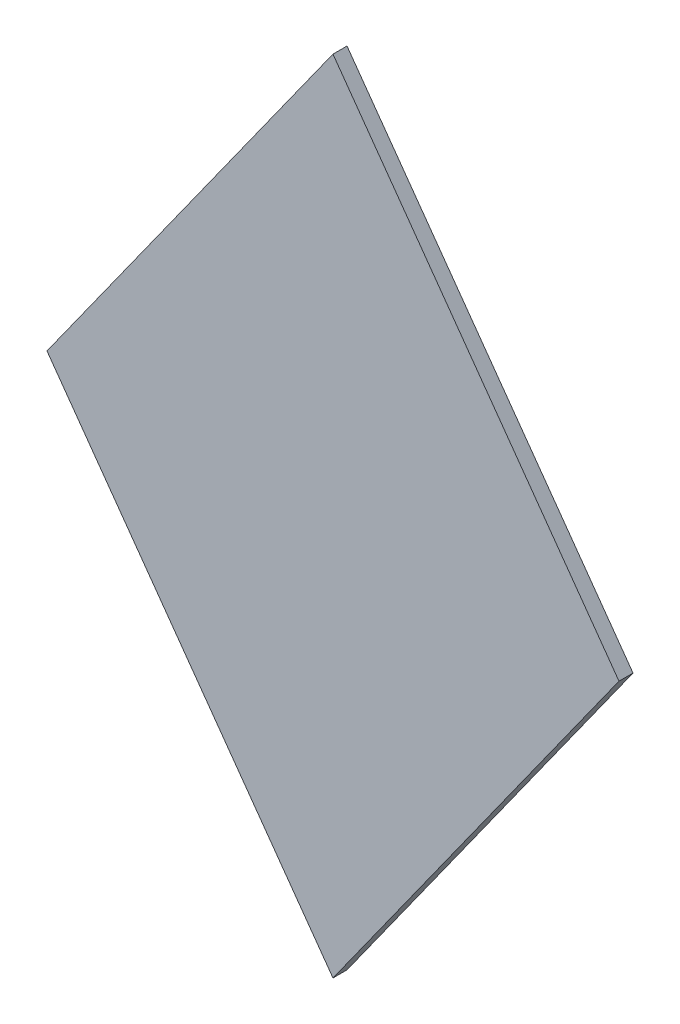
ISO-10303-21;
HEADER;
FILE_DESCRIPTION(('STEP AP214'),'2;1');
FILE_NAME('part.step','',(''),(''),'','','');
FILE_SCHEMA(('AUTOMOTIVE_DESIGN { 1 0 10303 214 1 1 1 1 }'));
ENDSEC;
DATA;
#1=APPLICATION_CONTEXT('core data for automotive mechanical design processes');
#2=APPLICATION_PROTOCOL_DEFINITION('international standard','automotive_design',2000,#1);
#3=PRODUCT_CONTEXT('',#1,'mechanical');
#4=PRODUCT('Part','Part','',(#3));
#5=PRODUCT_RELATED_PRODUCT_CATEGORY('part','',(#4));
#6=PRODUCT_DEFINITION_FORMATION('','',#4);
#7=PRODUCT_DEFINITION_CONTEXT('part definition',#1,'design');
#8=PRODUCT_DEFINITION('design','',#6,#7);
#9=PRODUCT_DEFINITION_SHAPE('','',#8);
#10=(LENGTH_UNIT() NAMED_UNIT(*) SI_UNIT(.MILLI.,.METRE.));
#11=(NAMED_UNIT(*) PLANE_ANGLE_UNIT() SI_UNIT($,.RADIAN.));
#12=(NAMED_UNIT(*) SI_UNIT($,.STERADIAN.) SOLID_ANGLE_UNIT());
#13=UNCERTAINTY_MEASURE_WITH_UNIT(LENGTH_MEASURE(1.E-05),#10,'distance_accuracy_value','');
#14=(GEOMETRIC_REPRESENTATION_CONTEXT(3) GLOBAL_UNCERTAINTY_ASSIGNED_CONTEXT((#13)) GLOBAL_UNIT_ASSIGNED_CONTEXT((#10,
#11,#12)) REPRESENTATION_CONTEXT('',''));
#15=CARTESIAN_POINT('',(0.,0.,0.));
#16=DIRECTION('',(0.,0.,1.));
#17=DIRECTION('',(1.,0.,0.));
#18=AXIS2_PLACEMENT_3D('',#15,#16,#17);
#19=CARTESIAN_POINT('',(40.75,0.,2.));
#20=DIRECTION('',(-0.813492323592446,-0.581575652392845,0.));
#21=DIRECTION('',(0.581575652392845,-0.813492323592446,0.));
#22=AXIS2_PLACEMENT_3D('',#19,#20,#21);
#23=PLANE('',#22);
#24=DIRECTION('',(-0.581575652392845,0.813492323592446,0.));
#25=VECTOR('',#24,1.);
#26=CARTESIAN_POINT('',(40.75,0.,0.));
#27=LINE('',#26,#25);
#28=CARTESIAN_POINT('',(40.75,0.,0.));
#29=VERTEX_POINT('',#28);
#30=CARTESIAN_POINT('',(0.,57.,0.));
#31=VERTEX_POINT('',#30);
#32=EDGE_CURVE('E96',#29,#31,#27,.T.);
#33=ORIENTED_EDGE('',*,*,#32,.T.);
#34=DIRECTION('',(0.,0.,-1.));
#35=VECTOR('',#34,1.);
#36=CARTESIAN_POINT('',(0.,57.,2.));
#37=LINE('',#36,#35);
#38=CARTESIAN_POINT('',(0.,57.,2.));
#39=VERTEX_POINT('',#38);
#40=EDGE_CURVE('E11',#39,#31,#37,.T.);
#41=ORIENTED_EDGE('',*,*,#40,.F.);
#42=DIRECTION('',(-0.581575652392845,0.813492323592446,0.));
#43=VECTOR('',#42,1.);
#44=CARTESIAN_POINT('',(40.75,0.,2.));
#45=LINE('',#44,#43);
#46=CARTESIAN_POINT('',(40.75,0.,2.));
#47=VERTEX_POINT('',#46);
#48=EDGE_CURVE('E84',#47,#39,#45,.T.);
#49=ORIENTED_EDGE('',*,*,#48,.F.);
#50=DIRECTION('',(0.,0.,-1.));
#51=VECTOR('',#50,1.);
#52=CARTESIAN_POINT('',(40.75,0.,2.));
#53=LINE('',#52,#51);
#54=EDGE_CURVE('E92',#47,#29,#53,.T.);
#55=ORIENTED_EDGE('',*,*,#54,.T.);
#56=EDGE_LOOP('',(#33,#41,#49,#55));
#57=FACE_BOUND('',#56,.T.);
#58=ADVANCED_FACE('F33',(#57),#23,.F.);
#59=CARTESIAN_POINT('',(0.,57.,2.));
#60=DIRECTION('',(0.813492323592446,-0.581575652392845,0.));
#61=DIRECTION('',(0.581575652392845,0.813492323592446,0.));
#62=AXIS2_PLACEMENT_3D('',#59,#60,#61);
#63=PLANE('',#62);
#64=DIRECTION('',(-0.581575652392845,-0.813492323592446,0.));
#65=VECTOR('',#64,1.);
#66=CARTESIAN_POINT('',(0.,57.,0.));
#67=LINE('',#66,#65);
#68=CARTESIAN_POINT('',(-40.75,0.,0.));
#69=VERTEX_POINT('',#68);
#70=EDGE_CURVE('E88',#31,#69,#67,.T.);
#71=ORIENTED_EDGE('',*,*,#70,.T.);
#72=DIRECTION('',(0.,0.,-1.));
#73=VECTOR('',#72,1.);
#74=CARTESIAN_POINT('',(-40.75,0.,2.));
#75=LINE('',#74,#73);
#76=CARTESIAN_POINT('',(-40.75,0.,2.));
#77=VERTEX_POINT('',#76);
#78=EDGE_CURVE('E41',#77,#69,#75,.T.);
#79=ORIENTED_EDGE('',*,*,#78,.F.);
#80=DIRECTION('',(-0.581575652392845,-0.813492323592446,0.));
#81=VECTOR('',#80,1.);
#82=CARTESIAN_POINT('',(0.,57.,2.));
#83=LINE('',#82,#81);
#84=EDGE_CURVE('E79',#39,#77,#83,.T.);
#85=ORIENTED_EDGE('',*,*,#84,.F.);
#86=ORIENTED_EDGE('',*,*,#40,.T.);
#87=EDGE_LOOP('',(#71,#79,#85,#86));
#88=FACE_BOUND('',#87,.T.);
#89=ADVANCED_FACE('F87',(#88),#63,.F.);
#90=CARTESIAN_POINT('',(-40.75,0.,2.));
#91=DIRECTION('',(0.813492323592446,0.581575652392845,0.));
#92=DIRECTION('',(-0.581575652392845,0.813492323592446,0.));
#93=AXIS2_PLACEMENT_3D('',#90,#91,#92);
#94=PLANE('',#93);
#95=DIRECTION('',(0.581575652392845,-0.813492323592446,0.));
#96=VECTOR('',#95,1.);
#97=CARTESIAN_POINT('',(-40.75,0.,0.));
#98=LINE('',#97,#96);
#99=CARTESIAN_POINT('',(0.,-57.,0.));
#100=VERTEX_POINT('',#99);
#101=EDGE_CURVE('E66',#69,#100,#98,.T.);
#102=ORIENTED_EDGE('',*,*,#101,.T.);
#103=DIRECTION('',(0.,0.,-1.));
#104=VECTOR('',#103,1.);
#105=CARTESIAN_POINT('',(0.,-57.,2.));
#106=LINE('',#105,#104);
#107=CARTESIAN_POINT('',(0.,-57.,2.));
#108=VERTEX_POINT('',#107);
#109=EDGE_CURVE('E89',#108,#100,#106,.T.);
#110=ORIENTED_EDGE('',*,*,#109,.F.);
#111=DIRECTION('',(0.581575652392845,-0.813492323592446,0.));
#112=VECTOR('',#111,1.);
#113=CARTESIAN_POINT('',(-40.75,0.,2.));
#114=LINE('',#113,#112);
#115=EDGE_CURVE('E82',#77,#108,#114,.T.);
#116=ORIENTED_EDGE('',*,*,#115,.F.);
#117=ORIENTED_EDGE('',*,*,#78,.T.);
#118=EDGE_LOOP('',(#102,#110,#116,#117));
#119=FACE_BOUND('',#118,.T.);
#120=ADVANCED_FACE('F90',(#119),#94,.F.);
#121=CARTESIAN_POINT('',(0.,-57.,2.));
#122=DIRECTION('',(-0.813492323592446,0.581575652392845,0.));
#123=DIRECTION('',(-0.581575652392845,-0.813492323592446,0.));
#124=AXIS2_PLACEMENT_3D('',#121,#122,#123);
#125=PLANE('',#124);
#126=DIRECTION('',(0.581575652392845,0.813492323592446,0.));
#127=VECTOR('',#126,1.);
#128=CARTESIAN_POINT('',(0.,-57.,0.));
#129=LINE('',#128,#127);
#130=EDGE_CURVE('E72',#100,#29,#129,.T.);
#131=ORIENTED_EDGE('',*,*,#130,.T.);
#132=ORIENTED_EDGE('',*,*,#54,.F.);
#133=DIRECTION('',(0.581575652392845,0.813492323592446,0.));
#134=VECTOR('',#133,1.);
#135=CARTESIAN_POINT('',(0.,-57.,2.));
#136=LINE('',#135,#134);
#137=EDGE_CURVE('E49',#108,#47,#136,.T.);
#138=ORIENTED_EDGE('',*,*,#137,.F.);
#139=ORIENTED_EDGE('',*,*,#109,.T.);
#140=EDGE_LOOP('',(#131,#132,#138,#139));
#141=FACE_BOUND('',#140,.T.);
#142=ADVANCED_FACE('F103',(#141),#125,.F.);
#143=CARTESIAN_POINT('',(0.,0.,2.));
#144=DIRECTION('',(0.,0.,1.));
#145=DIRECTION('',(1.,0.,0.));
#146=AXIS2_PLACEMENT_3D('',#143,#144,#145);
#147=PLANE('',#146);
#148=ORIENTED_EDGE('',*,*,#48,.T.);
#149=ORIENTED_EDGE('',*,*,#84,.T.);
#150=ORIENTED_EDGE('',*,*,#115,.T.);
#151=ORIENTED_EDGE('',*,*,#137,.T.);
#152=EDGE_LOOP('',(#148,#149,#150,#151));
#153=FACE_BOUND('',#152,.T.);
#154=ADVANCED_FACE('F80',(#153),#147,.T.);
#155=CARTESIAN_POINT('',(0.,0.,0.));
#156=DIRECTION('',(0.,0.,1.));
#157=DIRECTION('',(1.,0.,0.));
#158=AXIS2_PLACEMENT_3D('',#155,#156,#157);
#159=PLANE('',#158);
#160=ORIENTED_EDGE('',*,*,#32,.F.);
#161=ORIENTED_EDGE('',*,*,#130,.F.);
#162=ORIENTED_EDGE('',*,*,#101,.F.);
#163=ORIENTED_EDGE('',*,*,#70,.F.);
#164=EDGE_LOOP('',(#160,#161,#162,#163));
#165=FACE_BOUND('',#164,.T.);
#166=ADVANCED_FACE('F106',(#165),#159,.F.);
#167=CLOSED_SHELL('',(#58,#89,#120,#142,#154,#166));
#168=MANIFOLD_SOLID_BREP('B2',#167);
#169=ADVANCED_BREP_SHAPE_REPRESENTATION('',(#18,#168),#14);
#170=SHAPE_DEFINITION_REPRESENTATION(#9,#169);
ENDSEC;
END-ISO-10303-21;
